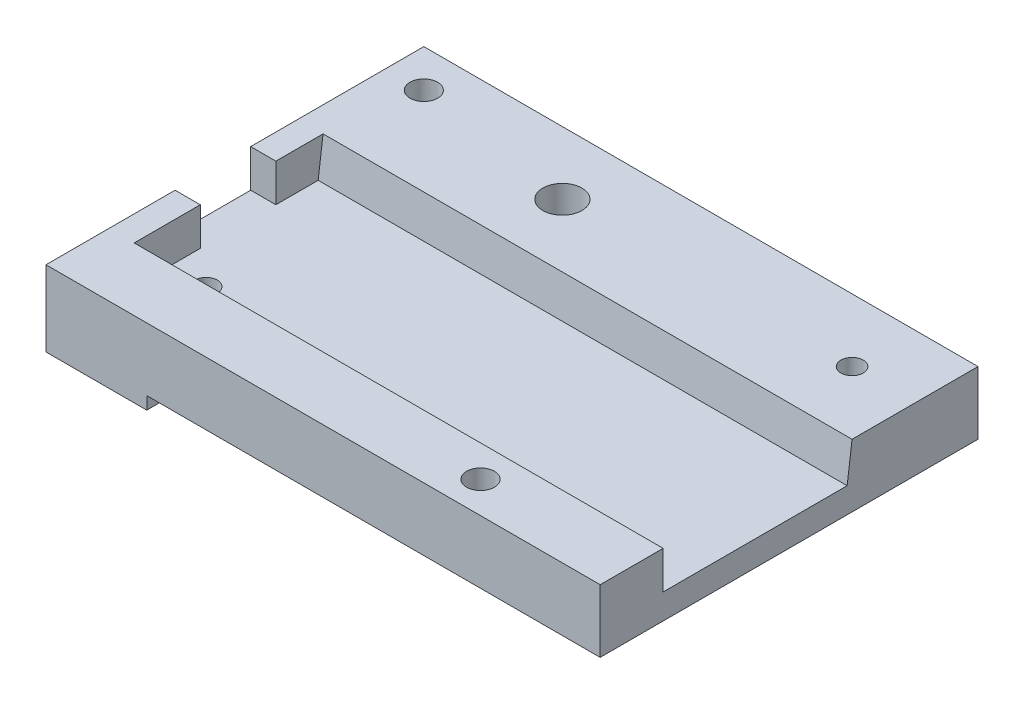
ISO-10303-21;
HEADER;
FILE_DESCRIPTION(('STEP AP214'),'2;1');
FILE_NAME('part.step','',(''),(''),'','','');
FILE_SCHEMA(('AUTOMOTIVE_DESIGN { 1 0 10303 214 1 1 1 1 }'));
ENDSEC;
DATA;
#1=APPLICATION_CONTEXT('core data for automotive mechanical design processes');
#2=APPLICATION_PROTOCOL_DEFINITION('international standard','automotive_design',2000,#1);
#3=PRODUCT_CONTEXT('',#1,'mechanical');
#4=PRODUCT('Part','Part','',(#3));
#5=PRODUCT_RELATED_PRODUCT_CATEGORY('part','',(#4));
#6=PRODUCT_DEFINITION_FORMATION('','',#4);
#7=PRODUCT_DEFINITION_CONTEXT('part definition',#1,'design');
#8=PRODUCT_DEFINITION('design','',#6,#7);
#9=PRODUCT_DEFINITION_SHAPE('','',#8);
#10=(LENGTH_UNIT() NAMED_UNIT(*) SI_UNIT(.MILLI.,.METRE.));
#11=(NAMED_UNIT(*) PLANE_ANGLE_UNIT() SI_UNIT($,.RADIAN.));
#12=(NAMED_UNIT(*) SI_UNIT($,.STERADIAN.) SOLID_ANGLE_UNIT());
#13=UNCERTAINTY_MEASURE_WITH_UNIT(LENGTH_MEASURE(1.E-05),#10,'distance_accuracy_value','');
#14=(GEOMETRIC_REPRESENTATION_CONTEXT(3) GLOBAL_UNCERTAINTY_ASSIGNED_CONTEXT((#13)) GLOBAL_UNIT_ASSIGNED_CONTEXT((#10,
#11,#12)) REPRESENTATION_CONTEXT('',''));
#15=CARTESIAN_POINT('',(0.,0.,0.));
#16=DIRECTION('',(0.,0.,1.));
#17=DIRECTION('',(1.,0.,0.));
#18=AXIS2_PLACEMENT_3D('',#15,#16,#17);
#19=CARTESIAN_POINT('',(0.,5.,0.));
#20=DIRECTION('',(0.,1.,0.));
#21=DIRECTION('',(0.,0.,1.));
#22=AXIS2_PLACEMENT_3D('',#19,#20,#21);
#23=PLANE('',#22);
#24=CARTESIAN_POINT('',(17.,5.,-10.));
#25=DIRECTION('',(0.,1.,0.));
#26=DIRECTION('',(0.,0.,1.));
#27=AXIS2_PLACEMENT_3D('',#24,#25,#26);
#28=CIRCLE('',#27,0.889);
#29=CARTESIAN_POINT('',(17.,5.,-9.111));
#30=VERTEX_POINT('',#29);
#31=EDGE_CURVE('E237',#30,#30,#28,.T.);
#32=ORIENTED_EDGE('',*,*,#31,.F.);
#33=EDGE_LOOP('',(#32));
#34=FACE_BOUND('',#33,.T.);
#35=CARTESIAN_POINT('',(-19.,5.,-12.));
#36=DIRECTION('',(0.,1.,0.));
#37=DIRECTION('',(0.,0.,1.));
#38=AXIS2_PLACEMENT_3D('',#35,#36,#37);
#39=CIRCLE('',#38,1.1);
#40=CARTESIAN_POINT('',(-19.,5.,-10.9));
#41=VERTEX_POINT('',#40);
#42=EDGE_CURVE('E162',#41,#41,#39,.T.);
#43=ORIENTED_EDGE('',*,*,#42,.F.);
#44=EDGE_LOOP('',(#43));
#45=FACE_BOUND('',#44,.T.);
#46=DIRECTION('',(-1.,0.,0.));
#47=VECTOR('',#46,1.);
#48=CARTESIAN_POINT('',(-20.,5.,-1.25));
#49=LINE('',#48,#47);
#50=CARTESIAN_POINT('',(-20.,5.,-1.25));
#51=VERTEX_POINT('',#50);
#52=CARTESIAN_POINT('',(-22.,5.,-1.25));
#53=VERTEX_POINT('',#52);
#54=EDGE_CURVE('E159',#51,#53,#49,.T.);
#55=ORIENTED_EDGE('',*,*,#54,.F.);
#56=DIRECTION('',(0.,0.,1.));
#57=VECTOR('',#56,1.);
#58=CARTESIAN_POINT('',(-20.,5.,-1.25));
#59=LINE('',#58,#57);
#60=CARTESIAN_POINT('',(-20.,5.,-5.));
#61=VERTEX_POINT('',#60);
#62=EDGE_CURVE('E180',#61,#51,#59,.T.);
#63=ORIENTED_EDGE('',*,*,#62,.F.);
#64=DIRECTION('',(-1.,0.,0.));
#65=VECTOR('',#64,1.);
#66=CARTESIAN_POINT('',(-20.,5.,-5.));
#67=LINE('',#66,#65);
#68=CARTESIAN_POINT('',(22.,5.,-5.));
#69=VERTEX_POINT('',#68);
#70=EDGE_CURVE('E178',#69,#61,#67,.T.);
#71=ORIENTED_EDGE('',*,*,#70,.F.);
#72=DIRECTION('',(0.,0.,-1.));
#73=VECTOR('',#72,1.);
#74=CARTESIAN_POINT('',(22.,5.,-15.));
#75=LINE('',#74,#73);
#76=CARTESIAN_POINT('',(22.,5.,-15.));
#77=VERTEX_POINT('',#76);
#78=EDGE_CURVE('E260',#69,#77,#75,.T.);
#79=ORIENTED_EDGE('',*,*,#78,.T.);
#80=DIRECTION('',(-1.,0.,0.));
#81=VECTOR('',#80,1.);
#82=CARTESIAN_POINT('',(-22.,5.,-15.));
#83=LINE('',#82,#81);
#84=CARTESIAN_POINT('',(-22.,5.,-15.));
#85=VERTEX_POINT('',#84);
#86=EDGE_CURVE('E259',#77,#85,#83,.T.);
#87=ORIENTED_EDGE('',*,*,#86,.T.);
#88=DIRECTION('',(0.,0.,1.));
#89=VECTOR('',#88,1.);
#90=CARTESIAN_POINT('',(-22.,5.,-15.));
#91=LINE('',#90,#89);
#92=EDGE_CURVE('E292',#85,#53,#91,.T.);
#93=ORIENTED_EDGE('',*,*,#92,.T.);
#94=EDGE_LOOP('',(#55,#63,#71,#79,#87,#93));
#95=FACE_BOUND('',#94,.T.);
#96=CARTESIAN_POINT('',(-5.99999999999999,5.,-10.));
#97=DIRECTION('',(0.,1.,0.));
#98=DIRECTION('',(0.,0.,1.));
#99=AXIS2_PLACEMENT_3D('',#96,#97,#98);
#100=CIRCLE('',#99,1.55);
#101=CARTESIAN_POINT('',(-5.99999999999999,5.,-8.45));
#102=VERTEX_POINT('',#101);
#103=EDGE_CURVE('E186',#102,#102,#100,.T.);
#104=ORIENTED_EDGE('',*,*,#103,.F.);
#105=EDGE_LOOP('',(#104));
#106=FACE_BOUND('',#105,.T.);
#107=ADVANCED_FACE('F33',(#34,#45,#95,#106),#23,.T.);
#108=CARTESIAN_POINT('',(0.,0.,0.));
#109=DIRECTION('',(0.,1.,0.));
#110=DIRECTION('',(0.,0.,1.));
#111=AXIS2_PLACEMENT_3D('',#108,#109,#110);
#112=PLANE('',#111);
#113=CARTESIAN_POINT('',(17.,0.,-10.));
#114=DIRECTION('',(0.,1.,0.));
#115=DIRECTION('',(0.,0.,1.));
#116=AXIS2_PLACEMENT_3D('',#113,#114,#115);
#117=CIRCLE('',#116,0.889);
#118=CARTESIAN_POINT('',(17.,0.,-9.111));
#119=VERTEX_POINT('',#118);
#120=EDGE_CURVE('E233',#119,#119,#117,.T.);
#121=ORIENTED_EDGE('',*,*,#120,.T.);
#122=EDGE_LOOP('',(#121));
#123=FACE_BOUND('',#122,.T.);
#124=CARTESIAN_POINT('',(-5.99999999999999,0.,-10.));
#125=DIRECTION('',(0.,1.,0.));
#126=DIRECTION('',(0.,0.,1.));
#127=AXIS2_PLACEMENT_3D('',#124,#125,#126);
#128=CIRCLE('',#127,1.55);
#129=CARTESIAN_POINT('',(-5.99999999999999,0.,-8.45));
#130=VERTEX_POINT('',#129);
#131=EDGE_CURVE('E197',#130,#130,#128,.T.);
#132=ORIENTED_EDGE('',*,*,#131,.T.);
#133=EDGE_LOOP('',(#132));
#134=FACE_BOUND('',#133,.T.);
#135=DIRECTION('',(0.,0.,1.));
#136=VECTOR('',#135,1.);
#137=CARTESIAN_POINT('',(-14.,0.,-15.));
#138=LINE('',#137,#136);
#139=CARTESIAN_POINT('',(-14.,0.,-15.));
#140=VERTEX_POINT('',#139);
#141=CARTESIAN_POINT('',(-14.,0.,15.));
#142=VERTEX_POINT('',#141);
#143=EDGE_CURVE('E200',#140,#142,#138,.T.);
#144=ORIENTED_EDGE('',*,*,#143,.F.);
#145=DIRECTION('',(-1.,0.,0.));
#146=VECTOR('',#145,1.);
#147=CARTESIAN_POINT('',(-22.,0.,-15.));
#148=LINE('',#147,#146);
#149=CARTESIAN_POINT('',(22.,0.,-15.));
#150=VERTEX_POINT('',#149);
#151=EDGE_CURVE('E220',#150,#140,#148,.T.);
#152=ORIENTED_EDGE('',*,*,#151,.F.);
#153=DIRECTION('',(0.,0.,-1.));
#154=VECTOR('',#153,1.);
#155=CARTESIAN_POINT('',(22.,0.,-15.));
#156=LINE('',#155,#154);
#157=CARTESIAN_POINT('',(22.,0.,15.));
#158=VERTEX_POINT('',#157);
#159=EDGE_CURVE('E230',#158,#150,#156,.T.);
#160=ORIENTED_EDGE('',*,*,#159,.F.);
#161=DIRECTION('',(1.,0.,0.));
#162=VECTOR('',#161,1.);
#163=CARTESIAN_POINT('',(-22.,0.,15.));
#164=LINE('',#163,#162);
#165=EDGE_CURVE('E262',#142,#158,#164,.T.);
#166=ORIENTED_EDGE('',*,*,#165,.F.);
#167=EDGE_LOOP('',(#144,#152,#160,#166));
#168=FACE_BOUND('',#167,.T.);
#169=ADVANCED_FACE('F311',(#123,#134,#168),#112,.F.);
#170=CARTESIAN_POINT('',(22.,5.,-15.));
#171=DIRECTION('',(-1.,0.,0.));
#172=DIRECTION('',(0.,0.,1.));
#173=AXIS2_PLACEMENT_3D('',#170,#171,#172);
#174=PLANE('',#173);
#175=ORIENTED_EDGE('',*,*,#78,.F.);
#176=DIRECTION('',(0.,-0.991655617343237,0.128915230254624));
#177=VECTOR('',#176,1.);
#178=CARTESIAN_POINT('',(22.,6.27839512243095,-5.16619136591604));
#179=LINE('',#178,#177);
#180=CARTESIAN_POINT('',(22.,2.,-4.61));
#181=VERTEX_POINT('',#180);
#182=EDGE_CURVE('E11',#69,#181,#179,.T.);
#183=ORIENTED_EDGE('',*,*,#182,.T.);
#184=DIRECTION('',(0.,0.,-1.));
#185=VECTOR('',#184,1.);
#186=CARTESIAN_POINT('',(22.,2.,-5.));
#187=LINE('',#186,#185);
#188=CARTESIAN_POINT('',(22.,2.,10.));
#189=VERTEX_POINT('',#188);
#190=EDGE_CURVE('E152',#189,#181,#187,.T.);
#191=ORIENTED_EDGE('',*,*,#190,.F.);
#192=DIRECTION('',(0.,1.,0.));
#193=VECTOR('',#192,1.);
#194=CARTESIAN_POINT('',(22.,2.,10.));
#195=LINE('',#194,#193);
#196=CARTESIAN_POINT('',(22.,5.,10.));
#197=VERTEX_POINT('',#196);
#198=EDGE_CURVE('E144',#189,#197,#195,.T.);
#199=ORIENTED_EDGE('',*,*,#198,.T.);
#200=CARTESIAN_POINT('',(22.,5.,15.));
#201=VERTEX_POINT('',#200);
#202=EDGE_CURVE('E214',#201,#197,#75,.T.);
#203=ORIENTED_EDGE('',*,*,#202,.F.);
#204=DIRECTION('',(0.,-1.,0.));
#205=VECTOR('',#204,1.);
#206=CARTESIAN_POINT('',(22.,5.,15.));
#207=LINE('',#206,#205);
#208=EDGE_CURVE('E273',#201,#158,#207,.T.);
#209=ORIENTED_EDGE('',*,*,#208,.T.);
#210=ORIENTED_EDGE('',*,*,#159,.T.);
#211=DIRECTION('',(0.,-1.,0.));
#212=VECTOR('',#211,1.);
#213=CARTESIAN_POINT('',(22.,5.,-15.));
#214=LINE('',#213,#212);
#215=EDGE_CURVE('E239',#77,#150,#214,.T.);
#216=ORIENTED_EDGE('',*,*,#215,.F.);
#217=EDGE_LOOP('',(#175,#183,#191,#199,#203,#209,#210,#216));
#218=FACE_BOUND('',#217,.T.);
#219=ADVANCED_FACE('F249',(#218),#174,.F.);
#220=CARTESIAN_POINT('',(-22.,5.,-15.));
#221=DIRECTION('',(0.,0.,1.));
#222=DIRECTION('',(1.,0.,0.));
#223=AXIS2_PLACEMENT_3D('',#220,#221,#222);
#224=PLANE('',#223);
#225=ORIENTED_EDGE('',*,*,#151,.T.);
#226=DIRECTION('',(0.,1.,0.));
#227=VECTOR('',#226,1.);
#228=CARTESIAN_POINT('',(-14.,-1.,-15.));
#229=LINE('',#228,#227);
#230=CARTESIAN_POINT('',(-14.,-1.,-15.));
#231=VERTEX_POINT('',#230);
#232=EDGE_CURVE('E225',#231,#140,#229,.T.);
#233=ORIENTED_EDGE('',*,*,#232,.F.);
#234=DIRECTION('',(1.,0.,0.));
#235=VECTOR('',#234,1.);
#236=CARTESIAN_POINT('',(-22.,-1.,-15.));
#237=LINE('',#236,#235);
#238=CARTESIAN_POINT('',(-22.,-1.,-15.));
#239=VERTEX_POINT('',#238);
#240=EDGE_CURVE('E204',#239,#231,#237,.T.);
#241=ORIENTED_EDGE('',*,*,#240,.F.);
#242=DIRECTION('',(0.,-1.,0.));
#243=VECTOR('',#242,1.);
#244=CARTESIAN_POINT('',(-22.,5.,-15.));
#245=LINE('',#244,#243);
#246=EDGE_CURVE('E276',#85,#239,#245,.T.);
#247=ORIENTED_EDGE('',*,*,#246,.F.);
#248=ORIENTED_EDGE('',*,*,#86,.F.);
#249=ORIENTED_EDGE('',*,*,#215,.T.);
#250=EDGE_LOOP('',(#225,#233,#241,#247,#248,#249));
#251=FACE_BOUND('',#250,.T.);
#252=ADVANCED_FACE('F286',(#251),#224,.F.);
#253=CARTESIAN_POINT('',(-22.,5.,-15.));
#254=DIRECTION('',(1.,0.,0.));
#255=DIRECTION('',(0.,0.,-1.));
#256=AXIS2_PLACEMENT_3D('',#253,#254,#255);
#257=PLANE('',#256);
#258=CARTESIAN_POINT('',(-22.,5.,4.75));
#259=VERTEX_POINT('',#258);
#260=CARTESIAN_POINT('',(-22.,5.,15.));
#261=VERTEX_POINT('',#260);
#262=EDGE_CURVE('E261',#259,#261,#91,.T.);
#263=ORIENTED_EDGE('',*,*,#262,.F.);
#264=DIRECTION('',(0.,1.,0.));
#265=VECTOR('',#264,1.);
#266=CARTESIAN_POINT('',(-22.,2.,4.75));
#267=LINE('',#266,#265);
#268=CARTESIAN_POINT('',(-22.,2.,4.75));
#269=VERTEX_POINT('',#268);
#270=EDGE_CURVE('E187',#269,#259,#267,.T.);
#271=ORIENTED_EDGE('',*,*,#270,.F.);
#272=DIRECTION('',(0.,0.,1.));
#273=VECTOR('',#272,1.);
#274=CARTESIAN_POINT('',(-22.,2.,-1.25));
#275=LINE('',#274,#273);
#276=CARTESIAN_POINT('',(-22.,2.,-1.25));
#277=VERTEX_POINT('',#276);
#278=EDGE_CURVE('E171',#277,#269,#275,.T.);
#279=ORIENTED_EDGE('',*,*,#278,.F.);
#280=DIRECTION('',(0.,1.,0.));
#281=VECTOR('',#280,1.);
#282=CARTESIAN_POINT('',(-22.,2.,-1.25));
#283=LINE('',#282,#281);
#284=EDGE_CURVE('E189',#277,#53,#283,.T.);
#285=ORIENTED_EDGE('',*,*,#284,.T.);
#286=ORIENTED_EDGE('',*,*,#92,.F.);
#287=ORIENTED_EDGE('',*,*,#246,.T.);
#288=DIRECTION('',(0.,0.,-1.));
#289=VECTOR('',#288,1.);
#290=CARTESIAN_POINT('',(-22.,-1.,-15.));
#291=LINE('',#290,#289);
#292=CARTESIAN_POINT('',(-22.,-1.,15.));
#293=VERTEX_POINT('',#292);
#294=EDGE_CURVE('E201',#293,#239,#291,.T.);
#295=ORIENTED_EDGE('',*,*,#294,.F.);
#296=DIRECTION('',(0.,-1.,0.));
#297=VECTOR('',#296,1.);
#298=CARTESIAN_POINT('',(-22.,5.,15.));
#299=LINE('',#298,#297);
#300=EDGE_CURVE('E275',#261,#293,#299,.T.);
#301=ORIENTED_EDGE('',*,*,#300,.F.);
#302=EDGE_LOOP('',(#263,#271,#279,#285,#286,#287,#295,#301));
#303=FACE_BOUND('',#302,.T.);
#304=ADVANCED_FACE('F296',(#303),#257,.F.);
#305=CARTESIAN_POINT('',(-22.,5.,15.));
#306=DIRECTION('',(0.,0.,-1.));
#307=DIRECTION('',(-1.,0.,0.));
#308=AXIS2_PLACEMENT_3D('',#305,#306,#307);
#309=PLANE('',#308);
#310=ORIENTED_EDGE('',*,*,#300,.T.);
#311=DIRECTION('',(-1.,0.,0.));
#312=VECTOR('',#311,1.);
#313=CARTESIAN_POINT('',(-22.,-1.,15.));
#314=LINE('',#313,#312);
#315=CARTESIAN_POINT('',(-14.,-1.,15.));
#316=VERTEX_POINT('',#315);
#317=EDGE_CURVE('E208',#316,#293,#314,.T.);
#318=ORIENTED_EDGE('',*,*,#317,.F.);
#319=DIRECTION('',(0.,1.,0.));
#320=VECTOR('',#319,1.);
#321=CARTESIAN_POINT('',(-14.,-1.,15.));
#322=LINE('',#321,#320);
#323=EDGE_CURVE('E211',#316,#142,#322,.T.);
#324=ORIENTED_EDGE('',*,*,#323,.T.);
#325=ORIENTED_EDGE('',*,*,#165,.T.);
#326=ORIENTED_EDGE('',*,*,#208,.F.);
#327=DIRECTION('',(1.,0.,0.));
#328=VECTOR('',#327,1.);
#329=CARTESIAN_POINT('',(-22.,5.,15.));
#330=LINE('',#329,#328);
#331=EDGE_CURVE('E257',#261,#201,#330,.T.);
#332=ORIENTED_EDGE('',*,*,#331,.F.);
#333=EDGE_LOOP('',(#310,#318,#324,#325,#326,#332));
#334=FACE_BOUND('',#333,.T.);
#335=ADVANCED_FACE('F298',(#334),#309,.F.);
#336=CARTESIAN_POINT('',(10.,5.,12.5));
#337=DIRECTION('',(0.,1.,0.));
#338=DIRECTION('',(0.,0.,1.));
#339=AXIS2_PLACEMENT_3D('',#336,#337,#338);
#340=CIRCLE('',#339,1.1);
#341=CARTESIAN_POINT('',(10.,5.,13.6));
#342=VERTEX_POINT('',#341);
#343=EDGE_CURVE('E392',#342,#342,#340,.T.);
#344=ORIENTED_EDGE('',*,*,#343,.F.);
#345=EDGE_LOOP('',(#344));
#346=FACE_BOUND('',#345,.T.);
#347=DIRECTION('',(1.,0.,0.));
#348=VECTOR('',#347,1.);
#349=CARTESIAN_POINT('',(-20.,5.,4.75));
#350=LINE('',#349,#348);
#351=CARTESIAN_POINT('',(-20.,5.,4.75));
#352=VERTEX_POINT('',#351);
#353=EDGE_CURVE('E156',#259,#352,#350,.T.);
#354=ORIENTED_EDGE('',*,*,#353,.F.);
#355=ORIENTED_EDGE('',*,*,#262,.T.);
#356=ORIENTED_EDGE('',*,*,#331,.T.);
#357=ORIENTED_EDGE('',*,*,#202,.T.);
#358=DIRECTION('',(1.,0.,0.));
#359=VECTOR('',#358,1.);
#360=CARTESIAN_POINT('',(22.,5.,10.));
#361=LINE('',#360,#359);
#362=CARTESIAN_POINT('',(-20.,5.,10.));
#363=VERTEX_POINT('',#362);
#364=EDGE_CURVE('E175',#363,#197,#361,.T.);
#365=ORIENTED_EDGE('',*,*,#364,.F.);
#366=DIRECTION('',(0.,0.,1.));
#367=VECTOR('',#366,1.);
#368=CARTESIAN_POINT('',(-20.,5.,10.));
#369=LINE('',#368,#367);
#370=EDGE_CURVE('E141',#352,#363,#369,.T.);
#371=ORIENTED_EDGE('',*,*,#370,.F.);
#372=EDGE_LOOP('',(#354,#355,#356,#357,#365,#371));
#373=FACE_BOUND('',#372,.T.);
#374=ADVANCED_FACE('F255',(#346,#373),#23,.T.);
#375=CARTESIAN_POINT('',(-14.,-1.,-15.));
#376=DIRECTION('',(-1.,0.,0.));
#377=DIRECTION('',(0.,0.,1.));
#378=AXIS2_PLACEMENT_3D('',#375,#376,#377);
#379=PLANE('',#378);
#380=ORIENTED_EDGE('',*,*,#143,.T.);
#381=ORIENTED_EDGE('',*,*,#323,.F.);
#382=DIRECTION('',(0.,0.,1.));
#383=VECTOR('',#382,1.);
#384=CARTESIAN_POINT('',(-14.,-1.,-15.));
#385=LINE('',#384,#383);
#386=EDGE_CURVE('E206',#231,#316,#385,.T.);
#387=ORIENTED_EDGE('',*,*,#386,.F.);
#388=ORIENTED_EDGE('',*,*,#232,.T.);
#389=EDGE_LOOP('',(#380,#381,#387,#388));
#390=FACE_BOUND('',#389,.T.);
#391=ADVANCED_FACE('F305',(#390),#379,.F.);
#392=CARTESIAN_POINT('',(0.,-1.,0.));
#393=DIRECTION('',(0.,1.,0.));
#394=DIRECTION('',(0.,0.,1.));
#395=AXIS2_PLACEMENT_3D('',#392,#393,#394);
#396=PLANE('',#395);
#397=CARTESIAN_POINT('',(-17.14,-1.,7.14));
#398=DIRECTION('',(0.,1.,0.));
#399=DIRECTION('',(0.,0.,1.));
#400=AXIS2_PLACEMENT_3D('',#397,#398,#399);
#401=CIRCLE('',#400,0.889);
#402=CARTESIAN_POINT('',(-17.14,-1.,8.029));
#403=VERTEX_POINT('',#402);
#404=EDGE_CURVE('E389',#403,#403,#401,.T.);
#405=ORIENTED_EDGE('',*,*,#404,.T.);
#406=EDGE_LOOP('',(#405));
#407=FACE_BOUND('',#406,.T.);
#408=ORIENTED_EDGE('',*,*,#294,.T.);
#409=ORIENTED_EDGE('',*,*,#240,.T.);
#410=ORIENTED_EDGE('',*,*,#386,.T.);
#411=ORIENTED_EDGE('',*,*,#317,.T.);
#412=EDGE_LOOP('',(#408,#409,#410,#411));
#413=FACE_BOUND('',#412,.T.);
#414=ADVANCED_FACE('F322',(#407,#413),#396,.F.);
#415=CARTESIAN_POINT('',(-5.99999999999999,-1.000025,-10.));
#416=DIRECTION('',(0.,1.,0.));
#417=DIRECTION('',(0.,0.,1.));
#418=AXIS2_PLACEMENT_3D('',#415,#416,#417);
#419=CYLINDRICAL_SURFACE('',#418,1.55);
#420=ORIENTED_EDGE('',*,*,#103,.T.);
#421=EDGE_LOOP('',(#420));
#422=FACE_BOUND('',#421,.T.);
#423=ORIENTED_EDGE('',*,*,#131,.F.);
#424=EDGE_LOOP('',(#423));
#425=FACE_BOUND('',#424,.T.);
#426=ADVANCED_FACE('F326',(#422,#425),#419,.F.);
#427=CARTESIAN_POINT('',(-20.,2.,10.));
#428=DIRECTION('',(-1.,0.,0.));
#429=DIRECTION('',(0.,0.,1.));
#430=AXIS2_PLACEMENT_3D('',#427,#428,#429);
#431=PLANE('',#430);
#432=ORIENTED_EDGE('',*,*,#370,.T.);
#433=DIRECTION('',(0.,1.,0.));
#434=VECTOR('',#433,1.);
#435=CARTESIAN_POINT('',(-20.,2.,10.));
#436=LINE('',#435,#434);
#437=CARTESIAN_POINT('',(-20.,2.,10.));
#438=VERTEX_POINT('',#437);
#439=EDGE_CURVE('E134',#438,#363,#436,.T.);
#440=ORIENTED_EDGE('',*,*,#439,.F.);
#441=DIRECTION('',(0.,0.,1.));
#442=VECTOR('',#441,1.);
#443=CARTESIAN_POINT('',(-20.,2.,10.));
#444=LINE('',#443,#442);
#445=CARTESIAN_POINT('',(-20.,2.,4.75));
#446=VERTEX_POINT('',#445);
#447=EDGE_CURVE('E138',#446,#438,#444,.T.);
#448=ORIENTED_EDGE('',*,*,#447,.F.);
#449=DIRECTION('',(0.,1.,0.));
#450=VECTOR('',#449,1.);
#451=CARTESIAN_POINT('',(-20.,2.,4.75));
#452=LINE('',#451,#450);
#453=EDGE_CURVE('E184',#446,#352,#452,.T.);
#454=ORIENTED_EDGE('',*,*,#453,.T.);
#455=EDGE_LOOP('',(#432,#440,#448,#454));
#456=FACE_BOUND('',#455,.T.);
#457=ADVANCED_FACE('F136',(#456),#431,.F.);
#458=CARTESIAN_POINT('',(-20.,2.,4.75));
#459=DIRECTION('',(0.,0.,1.));
#460=DIRECTION('',(1.,0.,0.));
#461=AXIS2_PLACEMENT_3D('',#458,#459,#460);
#462=PLANE('',#461);
#463=ORIENTED_EDGE('',*,*,#353,.T.);
#464=ORIENTED_EDGE('',*,*,#453,.F.);
#465=DIRECTION('',(1.,0.,0.));
#466=VECTOR('',#465,1.);
#467=CARTESIAN_POINT('',(-20.,2.,4.75));
#468=LINE('',#467,#466);
#469=EDGE_CURVE('E145',#269,#446,#468,.T.);
#470=ORIENTED_EDGE('',*,*,#469,.F.);
#471=ORIENTED_EDGE('',*,*,#270,.T.);
#472=EDGE_LOOP('',(#463,#464,#470,#471));
#473=FACE_BOUND('',#472,.T.);
#474=ADVANCED_FACE('F333',(#473),#462,.F.);
#475=CARTESIAN_POINT('',(-20.,2.,-1.25));
#476=DIRECTION('',(0.,0.,-1.));
#477=DIRECTION('',(-1.,0.,0.));
#478=AXIS2_PLACEMENT_3D('',#475,#476,#477);
#479=PLANE('',#478);
#480=ORIENTED_EDGE('',*,*,#54,.T.);
#481=ORIENTED_EDGE('',*,*,#284,.F.);
#482=DIRECTION('',(-1.,0.,0.));
#483=VECTOR('',#482,1.);
#484=CARTESIAN_POINT('',(-20.,2.,-1.25));
#485=LINE('',#484,#483);
#486=CARTESIAN_POINT('',(-20.,2.,-1.25));
#487=VERTEX_POINT('',#486);
#488=EDGE_CURVE('E168',#487,#277,#485,.T.);
#489=ORIENTED_EDGE('',*,*,#488,.F.);
#490=DIRECTION('',(0.,1.,0.));
#491=VECTOR('',#490,1.);
#492=CARTESIAN_POINT('',(-20.,2.,-1.25));
#493=LINE('',#492,#491);
#494=EDGE_CURVE('E192',#487,#51,#493,.T.);
#495=ORIENTED_EDGE('',*,*,#494,.T.);
#496=EDGE_LOOP('',(#480,#481,#489,#495));
#497=FACE_BOUND('',#496,.T.);
#498=ADVANCED_FACE('F338',(#497),#479,.F.);
#499=CARTESIAN_POINT('',(-20.,2.,-1.25));
#500=DIRECTION('',(-1.,0.,0.));
#501=DIRECTION('',(0.,0.,1.));
#502=AXIS2_PLACEMENT_3D('',#499,#500,#501);
#503=PLANE('',#502);
#504=DIRECTION('',(0.,0.,1.));
#505=VECTOR('',#504,1.);
#506=CARTESIAN_POINT('',(-20.,2.,-1.25));
#507=LINE('',#506,#505);
#508=CARTESIAN_POINT('',(-20.,2.,-4.61));
#509=VERTEX_POINT('',#508);
#510=EDGE_CURVE('E166',#509,#487,#507,.T.);
#511=ORIENTED_EDGE('',*,*,#510,.F.);
#512=DIRECTION('',(0.,0.991655617343237,-0.128915230254624));
#513=VECTOR('',#512,1.);
#514=CARTESIAN_POINT('',(-20.,2.,-4.61));
#515=LINE('',#514,#513);
#516=EDGE_CURVE('E41',#509,#61,#515,.T.);
#517=ORIENTED_EDGE('',*,*,#516,.T.);
#518=ORIENTED_EDGE('',*,*,#62,.T.);
#519=ORIENTED_EDGE('',*,*,#494,.F.);
#520=EDGE_LOOP('',(#511,#517,#518,#519));
#521=FACE_BOUND('',#520,.T.);
#522=ADVANCED_FACE('F243',(#521),#503,.F.);
#523=CARTESIAN_POINT('',(22.,2.,10.));
#524=DIRECTION('',(0.,0.,1.));
#525=DIRECTION('',(1.,0.,0.));
#526=AXIS2_PLACEMENT_3D('',#523,#524,#525);
#527=PLANE('',#526);
#528=ORIENTED_EDGE('',*,*,#364,.T.);
#529=ORIENTED_EDGE('',*,*,#198,.F.);
#530=DIRECTION('',(1.,0.,0.));
#531=VECTOR('',#530,1.);
#532=CARTESIAN_POINT('',(22.,2.,10.));
#533=LINE('',#532,#531);
#534=EDGE_CURVE('E148',#438,#189,#533,.T.);
#535=ORIENTED_EDGE('',*,*,#534,.F.);
#536=ORIENTED_EDGE('',*,*,#439,.T.);
#537=EDGE_LOOP('',(#528,#529,#535,#536));
#538=FACE_BOUND('',#537,.T.);
#539=ADVANCED_FACE('F149',(#538),#527,.F.);
#540=CARTESIAN_POINT('',(0.,2.,0.));
#541=DIRECTION('',(0.,1.,0.));
#542=DIRECTION('',(0.,0.,1.));
#543=AXIS2_PLACEMENT_3D('',#540,#541,#542);
#544=PLANE('',#543);
#545=CARTESIAN_POINT('',(-17.14,2.,7.14));
#546=DIRECTION('',(0.,1.,0.));
#547=DIRECTION('',(0.,0.,1.));
#548=AXIS2_PLACEMENT_3D('',#545,#546,#547);
#549=CIRCLE('',#548,0.889);
#550=CARTESIAN_POINT('',(-17.14,2.,8.029));
#551=VERTEX_POINT('',#550);
#552=EDGE_CURVE('E236',#551,#551,#549,.T.);
#553=ORIENTED_EDGE('',*,*,#552,.F.);
#554=EDGE_LOOP('',(#553));
#555=FACE_BOUND('',#554,.T.);
#556=ORIENTED_EDGE('',*,*,#190,.T.);
#557=DIRECTION('',(-1.,0.,0.));
#558=VECTOR('',#557,1.);
#559=CARTESIAN_POINT('',(0.,2.,-4.61));
#560=LINE('',#559,#558);
#561=EDGE_CURVE('E238',#181,#509,#560,.T.);
#562=ORIENTED_EDGE('',*,*,#561,.T.);
#563=ORIENTED_EDGE('',*,*,#510,.T.);
#564=ORIENTED_EDGE('',*,*,#488,.T.);
#565=ORIENTED_EDGE('',*,*,#278,.T.);
#566=ORIENTED_EDGE('',*,*,#469,.T.);
#567=ORIENTED_EDGE('',*,*,#447,.T.);
#568=ORIENTED_EDGE('',*,*,#534,.T.);
#569=EDGE_LOOP('',(#556,#562,#563,#564,#565,#566,#567,#568));
#570=FACE_BOUND('',#569,.T.);
#571=ADVANCED_FACE('F154',(#555,#570),#544,.T.);
#572=CARTESIAN_POINT('',(-19.,3.,-12.));
#573=DIRECTION('',(0.,1.,0.));
#574=DIRECTION('',(0.,0.,1.));
#575=AXIS2_PLACEMENT_3D('',#572,#573,#574);
#576=CYLINDRICAL_SURFACE('',#575,1.1);
#577=CARTESIAN_POINT('',(-19.,3.,-12.));
#578=DIRECTION('',(0.,1.,0.));
#579=DIRECTION('',(0.,0.,1.));
#580=AXIS2_PLACEMENT_3D('',#577,#578,#579);
#581=CIRCLE('',#580,1.1);
#582=CARTESIAN_POINT('',(-19.,3.,-10.9));
#583=VERTEX_POINT('',#582);
#584=EDGE_CURVE('E176',#583,#583,#581,.T.);
#585=ORIENTED_EDGE('',*,*,#584,.F.);
#586=EDGE_LOOP('',(#585));
#587=FACE_BOUND('',#586,.T.);
#588=ORIENTED_EDGE('',*,*,#42,.T.);
#589=EDGE_LOOP('',(#588));
#590=FACE_BOUND('',#589,.T.);
#591=ADVANCED_FACE('F347',(#587,#590),#576,.F.);
#592=CARTESIAN_POINT('',(-19.,3.,-12.));
#593=DIRECTION('',(0.,1.,0.));
#594=DIRECTION('',(0.,0.,1.));
#595=AXIS2_PLACEMENT_3D('',#592,#593,#594);
#596=PLANE('',#595);
#597=ORIENTED_EDGE('',*,*,#584,.T.);
#598=EDGE_LOOP('',(#597));
#599=FACE_BOUND('',#598,.T.);
#600=ADVANCED_FACE('F351',(#599),#596,.T.);
#601=CARTESIAN_POINT('',(10.,3.,12.5));
#602=DIRECTION('',(0.,1.,0.));
#603=DIRECTION('',(0.,0.,1.));
#604=AXIS2_PLACEMENT_3D('',#601,#602,#603);
#605=CYLINDRICAL_SURFACE('',#604,1.1);
#606=CARTESIAN_POINT('',(10.,3.,12.5));
#607=DIRECTION('',(0.,1.,0.));
#608=DIRECTION('',(0.,0.,1.));
#609=AXIS2_PLACEMENT_3D('',#606,#607,#608);
#610=CIRCLE('',#609,1.1);
#611=CARTESIAN_POINT('',(10.,3.,13.6));
#612=VERTEX_POINT('',#611);
#613=EDGE_CURVE('E393',#612,#612,#610,.T.);
#614=ORIENTED_EDGE('',*,*,#613,.F.);
#615=EDGE_LOOP('',(#614));
#616=FACE_BOUND('',#615,.T.);
#617=ORIENTED_EDGE('',*,*,#343,.T.);
#618=EDGE_LOOP('',(#617));
#619=FACE_BOUND('',#618,.T.);
#620=ADVANCED_FACE('F355',(#616,#619),#605,.F.);
#621=CARTESIAN_POINT('',(10.,3.,12.5));
#622=DIRECTION('',(0.,1.,0.));
#623=DIRECTION('',(0.,0.,1.));
#624=AXIS2_PLACEMENT_3D('',#621,#622,#623);
#625=PLANE('',#624);
#626=ORIENTED_EDGE('',*,*,#613,.T.);
#627=EDGE_LOOP('',(#626));
#628=FACE_BOUND('',#627,.T.);
#629=ADVANCED_FACE('F359',(#628),#625,.T.);
#630=CARTESIAN_POINT('',(-17.14,-1.000025,7.14));
#631=DIRECTION('',(0.,1.,0.));
#632=DIRECTION('',(0.,0.,1.));
#633=AXIS2_PLACEMENT_3D('',#630,#631,#632);
#634=CYLINDRICAL_SURFACE('',#633,0.889);
#635=ORIENTED_EDGE('',*,*,#552,.T.);
#636=EDGE_LOOP('',(#635));
#637=FACE_BOUND('',#636,.T.);
#638=ORIENTED_EDGE('',*,*,#404,.F.);
#639=EDGE_LOOP('',(#638));
#640=FACE_BOUND('',#639,.T.);
#641=ADVANCED_FACE('F363',(#637,#640),#634,.F.);
#642=CARTESIAN_POINT('',(17.,-1.000025,-10.));
#643=DIRECTION('',(0.,1.,0.));
#644=DIRECTION('',(0.,0.,1.));
#645=AXIS2_PLACEMENT_3D('',#642,#643,#644);
#646=CYLINDRICAL_SURFACE('',#645,0.889);
#647=ORIENTED_EDGE('',*,*,#31,.T.);
#648=EDGE_LOOP('',(#647));
#649=FACE_BOUND('',#648,.T.);
#650=ORIENTED_EDGE('',*,*,#120,.F.);
#651=EDGE_LOOP('',(#650));
#652=FACE_BOUND('',#651,.T.);
#653=ADVANCED_FACE('F367',(#649,#652),#646,.F.);
#654=CARTESIAN_POINT('',(0.,2.,-4.61));
#655=DIRECTION('',(0.,-0.128915230254624,-0.991655617343237));
#656=DIRECTION('',(-1.,0.,0.));
#657=AXIS2_PLACEMENT_3D('',#654,#655,#656);
#658=PLANE('',#657);
#659=ORIENTED_EDGE('',*,*,#182,.F.);
#660=ORIENTED_EDGE('',*,*,#70,.T.);
#661=ORIENTED_EDGE('',*,*,#516,.F.);
#662=ORIENTED_EDGE('',*,*,#561,.F.);
#663=EDGE_LOOP('',(#659,#660,#661,#662));
#664=FACE_BOUND('',#663,.T.);
#665=ADVANCED_FACE('F35',(#664),#658,.F.);
#666=CLOSED_SHELL('',(#107,#169,#219,#252,#304,#335,#374,#391,#414,#426,#457,#474,#498,#522,
#539,#571,#591,#600,#620,#629,#641,#653,#665));
#667=MANIFOLD_SOLID_BREP('B2',#666);
#668=ADVANCED_BREP_SHAPE_REPRESENTATION('',(#18,#667),#14);
#669=SHAPE_DEFINITION_REPRESENTATION(#9,#668);
ENDSEC;
END-ISO-10303-21;
